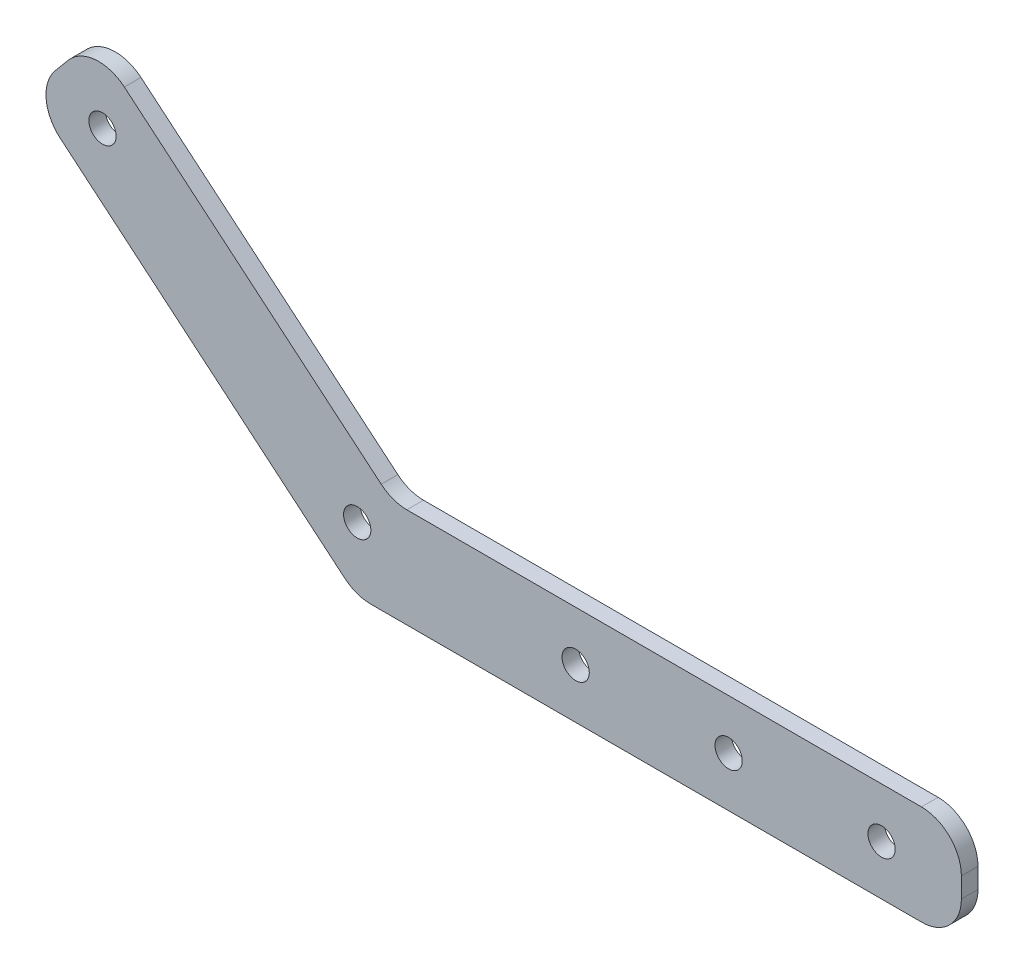
ISO-10303-21;
HEADER;
FILE_DESCRIPTION(('STEP AP214'),'2;1');
FILE_NAME('part.step','',(''),(''),'','','');
FILE_SCHEMA(('AUTOMOTIVE_DESIGN { 1 0 10303 214 1 1 1 1 }'));
ENDSEC;
DATA;
#1=APPLICATION_CONTEXT('core data for automotive mechanical design processes');
#2=APPLICATION_PROTOCOL_DEFINITION('international standard','automotive_design',2000,#1);
#3=PRODUCT_CONTEXT('',#1,'mechanical');
#4=PRODUCT('Part','Part','',(#3));
#5=PRODUCT_RELATED_PRODUCT_CATEGORY('part','',(#4));
#6=PRODUCT_DEFINITION_FORMATION('','',#4);
#7=PRODUCT_DEFINITION_CONTEXT('part definition',#1,'design');
#8=PRODUCT_DEFINITION('design','',#6,#7);
#9=PRODUCT_DEFINITION_SHAPE('','',#8);
#10=(LENGTH_UNIT() NAMED_UNIT(*) SI_UNIT(.MILLI.,.METRE.));
#11=(NAMED_UNIT(*) PLANE_ANGLE_UNIT() SI_UNIT($,.RADIAN.));
#12=(NAMED_UNIT(*) SI_UNIT($,.STERADIAN.) SOLID_ANGLE_UNIT());
#13=UNCERTAINTY_MEASURE_WITH_UNIT(LENGTH_MEASURE(1.E-05),#10,'distance_accuracy_value','');
#14=(GEOMETRIC_REPRESENTATION_CONTEXT(3) GLOBAL_UNCERTAINTY_ASSIGNED_CONTEXT((#13)) GLOBAL_UNIT_ASSIGNED_CONTEXT((#10,
#11,#12)) REPRESENTATION_CONTEXT('',''));
#15=CARTESIAN_POINT('',(0.,0.,0.));
#16=DIRECTION('',(0.,0.,1.));
#17=DIRECTION('',(1.,0.,0.));
#18=AXIS2_PLACEMENT_3D('',#15,#16,#17);
#19=CARTESIAN_POINT('',(0.,0.,3.175));
#20=DIRECTION('',(0.,0.,1.));
#21=DIRECTION('',(1.,0.,0.));
#22=AXIS2_PLACEMENT_3D('',#19,#20,#21);
#23=PLANE('',#22);
#24=CARTESIAN_POINT('',(-164.021911069028,43.5371171796239,3.175));
#25=DIRECTION('',(0.,0.,1.));
#26=DIRECTION('',(1.,0.,0.));
#27=AXIS2_PLACEMENT_3D('',#24,#25,#26);
#28=CIRCLE('',#27,2.60350000000002);
#29=CARTESIAN_POINT('',(-161.418411069028,43.5371171796239,3.175));
#30=VERTEX_POINT('',#29);
#31=EDGE_CURVE('E294',#30,#30,#28,.T.);
#32=ORIENTED_EDGE('',*,*,#31,.F.);
#33=EDGE_LOOP('',(#32));
#34=FACE_BOUND('',#33,.T.);
#35=CARTESIAN_POINT('',(-44.45,0.,3.175));
#36=DIRECTION('',(0.,0.,1.));
#37=DIRECTION('',(1.,0.,0.));
#38=AXIS2_PLACEMENT_3D('',#35,#36,#37);
#39=CIRCLE('',#38,2.6035);
#40=CARTESIAN_POINT('',(-41.8465,0.,3.175));
#41=VERTEX_POINT('',#40);
#42=EDGE_CURVE('E278',#41,#41,#39,.T.);
#43=ORIENTED_EDGE('',*,*,#42,.F.);
#44=EDGE_LOOP('',(#43));
#45=FACE_BOUND('',#44,.T.);
#46=DIRECTION('',(-0.64278760968654,-0.766044443118978,0.));
#47=VECTOR('',#46,1.);
#48=CARTESIAN_POINT('',(-165.682370628852,57.3644126147474,3.175));
#49=LINE('',#48,#47);
#50=CARTESIAN_POINT('',(-170.580412214663,51.5271539581808,3.175));
#51=VERTEX_POINT('',#50);
#52=CARTESIAN_POINT('',(-173.029433007569,48.6085246298974,3.175));
#53=VERTEX_POINT('',#52);
#54=EDGE_CURVE('E251',#51,#53,#49,.T.);
#55=ORIENTED_EDGE('',*,*,#54,.T.);
#56=CARTESIAN_POINT('',(-167.192174351003,43.710483044086,3.175));
#57=DIRECTION('',(0.,0.,1.));
#58=DIRECTION('',(1.,0.,0.));
#59=AXIS2_PLACEMENT_3D('',#56,#57,#58);
#60=CIRCLE('',#59,7.62);
#61=CARTESIAN_POINT('',(-172.090215936814,37.8732243875194,3.175));
#62=VERTEX_POINT('',#61);
#63=EDGE_CURVE('E202',#53,#62,#60,.T.);
#64=ORIENTED_EDGE('',*,*,#63,.T.);
#65=DIRECTION('',(0.766044443118978,-0.64278760968654,0.));
#66=VECTOR('',#65,1.);
#67=CARTESIAN_POINT('',(-177.927474593381,42.7712659733308,3.175));
#68=LINE('',#67,#66);
#69=CARTESIAN_POINT('',(-117.727800141104,-7.74225865656661,3.175));
#70=VERTEX_POINT('',#69);
#71=EDGE_CURVE('E152',#62,#70,#68,.T.);
#72=ORIENTED_EDGE('',*,*,#71,.T.);
#73=CARTESIAN_POINT('',(-112.829758555293,-1.905,3.175));
#74=DIRECTION('',(0.,0.,1.));
#75=DIRECTION('',(1.,0.,0.));
#76=AXIS2_PLACEMENT_3D('',#73,#74,#75);
#77=CIRCLE('',#76,7.62);
#78=CARTESIAN_POINT('',(-112.829758555293,-9.525,3.175));
#79=VERTEX_POINT('',#78);
#80=EDGE_CURVE('E199',#70,#79,#77,.T.);
#81=ORIENTED_EDGE('',*,*,#80,.T.);
#82=DIRECTION('',(1.,0.,0.));
#83=VECTOR('',#82,1.);
#84=CARTESIAN_POINT('',(-115.603211740401,-9.52500000000001,3.175));
#85=LINE('',#84,#83);
#86=CARTESIAN_POINT('',(-7.61999999999999,-9.52499999999994,3.175));
#87=VERTEX_POINT('',#86);
#88=EDGE_CURVE('E161',#79,#87,#85,.T.);
#89=ORIENTED_EDGE('',*,*,#88,.T.);
#90=CARTESIAN_POINT('',(-7.62,-1.90499999999994,3.175));
#91=DIRECTION('',(0.,0.,1.));
#92=DIRECTION('',(1.,0.,0.));
#93=AXIS2_PLACEMENT_3D('',#90,#91,#92);
#94=CIRCLE('',#93,7.62);
#95=CARTESIAN_POINT('',(0.,-1.90499999999994,3.175));
#96=VERTEX_POINT('',#95);
#97=EDGE_CURVE('E196',#87,#96,#94,.T.);
#98=ORIENTED_EDGE('',*,*,#97,.T.);
#99=DIRECTION('',(0.,1.,0.));
#100=VECTOR('',#99,1.);
#101=CARTESIAN_POINT('',(0.,-9.52499999999993,3.175));
#102=LINE('',#101,#100);
#103=CARTESIAN_POINT('',(0.,1.905,3.175));
#104=VERTEX_POINT('',#103);
#105=EDGE_CURVE('E167',#96,#104,#102,.T.);
#106=ORIENTED_EDGE('',*,*,#105,.T.);
#107=CARTESIAN_POINT('',(-7.62,1.90499999999999,3.175));
#108=DIRECTION('',(0.,0.,1.));
#109=DIRECTION('',(1.,0.,0.));
#110=AXIS2_PLACEMENT_3D('',#107,#108,#109);
#111=CIRCLE('',#110,7.62);
#112=CARTESIAN_POINT('',(-7.62,9.52499999999999,3.175));
#113=VERTEX_POINT('',#112);
#114=EDGE_CURVE('E193',#104,#113,#111,.T.);
#115=ORIENTED_EDGE('',*,*,#114,.T.);
#116=DIRECTION('',(-1.,0.,0.));
#117=VECTOR('',#116,1.);
#118=CARTESIAN_POINT('',(0.,9.525,3.175));
#119=LINE('',#118,#117);
#120=CARTESIAN_POINT('',(-105.896125592522,9.52499999999991,3.175));
#121=VERTEX_POINT('',#120);
#122=EDGE_CURVE('E252',#113,#121,#119,.T.);
#123=ORIENTED_EDGE('',*,*,#122,.T.);
#124=CARTESIAN_POINT('',(-105.896125592522,17.1449999999999,3.175));
#125=DIRECTION('',(0.,0.,1.));
#126=DIRECTION('',(1.,0.,0.));
#127=AXIS2_PLACEMENT_3D('',#124,#125,#126);
#128=CIRCLE('',#127,7.62);
#129=CARTESIAN_POINT('',(-110.794167178333,11.3077413434333,3.175));
#130=VERTEX_POINT('',#129);
#131=EDGE_CURVE('E11',#121,#130,#128,.F.);
#132=ORIENTED_EDGE('',*,*,#131,.T.);
#133=DIRECTION('',(-0.766044443118978,0.64278760968654,0.));
#134=VECTOR('',#133,1.);
#135=CARTESIAN_POINT('',(-108.66957877763,9.52499999999991,3.175));
#136=LINE('',#135,#134);
#137=CARTESIAN_POINT('',(-159.845111972285,52.466371028936,3.175));
#138=VERTEX_POINT('',#137);
#139=EDGE_CURVE('E248',#130,#138,#136,.T.);
#140=ORIENTED_EDGE('',*,*,#139,.T.);
#141=CARTESIAN_POINT('',(-164.743153558097,46.6291123723694,3.175));
#142=DIRECTION('',(0.,0.,1.));
#143=DIRECTION('',(1.,0.,0.));
#144=AXIS2_PLACEMENT_3D('',#141,#142,#143);
#145=CIRCLE('',#144,7.62);
#146=EDGE_CURVE('E190',#138,#51,#145,.T.);
#147=ORIENTED_EDGE('',*,*,#146,.T.);
#148=EDGE_LOOP('',(#55,#64,#72,#81,#89,#98,#106,#115,#123,#132,#140,#147));
#149=FACE_BOUND('',#148,.T.);
#150=CARTESIAN_POINT('',(-73.66,0.,3.175));
#151=DIRECTION('',(0.,0.,1.));
#152=DIRECTION('',(1.,0.,0.));
#153=AXIS2_PLACEMENT_3D('',#150,#151,#152);
#154=CIRCLE('',#153,2.60349999999999);
#155=CARTESIAN_POINT('',(-71.0565,0.,3.175));
#156=VERTEX_POINT('',#155);
#157=EDGE_CURVE('E267',#156,#156,#154,.T.);
#158=ORIENTED_EDGE('',*,*,#157,.F.);
#159=EDGE_LOOP('',(#158));
#160=FACE_BOUND('',#159,.T.);
#161=CARTESIAN_POINT('',(-15.24,0.,3.175));
#162=DIRECTION('',(0.,0.,1.));
#163=DIRECTION('',(1.,0.,0.));
#164=AXIS2_PLACEMENT_3D('',#161,#162,#163);
#165=CIRCLE('',#164,2.6035);
#166=CARTESIAN_POINT('',(-12.6365,0.,3.175));
#167=VERTEX_POINT('',#166);
#168=EDGE_CURVE('E286',#167,#167,#165,.T.);
#169=ORIENTED_EDGE('',*,*,#168,.F.);
#170=EDGE_LOOP('',(#169));
#171=FACE_BOUND('',#170,.T.);
#172=CARTESIAN_POINT('',(-115.378088930972,2.72010396452861,3.175));
#173=DIRECTION('',(0.,0.,1.));
#174=DIRECTION('',(1.,0.,0.));
#175=AXIS2_PLACEMENT_3D('',#172,#173,#174);
#176=CIRCLE('',#175,2.60349999999999);
#177=CARTESIAN_POINT('',(-112.774588930972,2.72010396452861,3.175));
#178=VERTEX_POINT('',#177);
#179=EDGE_CURVE('E302',#178,#178,#176,.T.);
#180=ORIENTED_EDGE('',*,*,#179,.F.);
#181=EDGE_LOOP('',(#180));
#182=FACE_BOUND('',#181,.T.);
#183=ADVANCED_FACE('F41',(#34,#45,#149,#160,#171,#182),#23,.T.);
#184=CARTESIAN_POINT('',(0.,0.,0.));
#185=DIRECTION('',(0.,0.,1.));
#186=DIRECTION('',(1.,0.,0.));
#187=AXIS2_PLACEMENT_3D('',#184,#185,#186);
#188=PLANE('',#187);
#189=DIRECTION('',(0.766044443118978,-0.64278760968654,0.));
#190=VECTOR('',#189,1.);
#191=CARTESIAN_POINT('',(-177.927474593381,42.7712659733308,0.));
#192=LINE('',#191,#190);
#193=CARTESIAN_POINT('',(-172.090215936814,37.8732243875194,0.));
#194=VERTEX_POINT('',#193);
#195=CARTESIAN_POINT('',(-117.727800141104,-7.74225865656661,0.));
#196=VERTEX_POINT('',#195);
#197=EDGE_CURVE('E149',#194,#196,#192,.T.);
#198=ORIENTED_EDGE('',*,*,#197,.F.);
#199=CARTESIAN_POINT('',(-167.192174351003,43.710483044086,0.));
#200=DIRECTION('',(0.,0.,1.));
#201=DIRECTION('',(1.,0.,0.));
#202=AXIS2_PLACEMENT_3D('',#199,#200,#201);
#203=CIRCLE('',#202,7.62);
#204=CARTESIAN_POINT('',(-173.029433007569,48.6085246298974,0.));
#205=VERTEX_POINT('',#204);
#206=EDGE_CURVE('E131',#194,#205,#203,.F.);
#207=ORIENTED_EDGE('',*,*,#206,.T.);
#208=DIRECTION('',(-0.64278760968654,-0.766044443118978,0.));
#209=VECTOR('',#208,1.);
#210=CARTESIAN_POINT('',(-165.682370628852,57.3644126147474,0.));
#211=LINE('',#210,#209);
#212=CARTESIAN_POINT('',(-170.580412214663,51.5271539581808,0.));
#213=VERTEX_POINT('',#212);
#214=EDGE_CURVE('E162',#213,#205,#211,.T.);
#215=ORIENTED_EDGE('',*,*,#214,.F.);
#216=CARTESIAN_POINT('',(-164.743153558097,46.6291123723694,0.));
#217=DIRECTION('',(0.,0.,1.));
#218=DIRECTION('',(1.,0.,0.));
#219=AXIS2_PLACEMENT_3D('',#216,#217,#218);
#220=CIRCLE('',#219,7.62);
#221=CARTESIAN_POINT('',(-159.845111972285,52.466371028936,0.));
#222=VERTEX_POINT('',#221);
#223=EDGE_CURVE('E154',#213,#222,#220,.F.);
#224=ORIENTED_EDGE('',*,*,#223,.T.);
#225=DIRECTION('',(-0.766044443118978,0.64278760968654,0.));
#226=VECTOR('',#225,1.);
#227=CARTESIAN_POINT('',(-108.66957877763,9.52499999999991,0.));
#228=LINE('',#227,#226);
#229=CARTESIAN_POINT('',(-110.794167178333,11.3077413434333,0.));
#230=VERTEX_POINT('',#229);
#231=EDGE_CURVE('E169',#230,#222,#228,.T.);
#232=ORIENTED_EDGE('',*,*,#231,.F.);
#233=CARTESIAN_POINT('',(-105.896125592522,17.1449999999999,0.));
#234=DIRECTION('',(0.,0.,1.));
#235=DIRECTION('',(1.,0.,0.));
#236=AXIS2_PLACEMENT_3D('',#233,#234,#235);
#237=CIRCLE('',#236,7.62);
#238=CARTESIAN_POINT('',(-105.896125592522,9.52499999999991,0.));
#239=VERTEX_POINT('',#238);
#240=EDGE_CURVE('E50',#230,#239,#237,.T.);
#241=ORIENTED_EDGE('',*,*,#240,.T.);
#242=DIRECTION('',(-1.,0.,0.));
#243=VECTOR('',#242,1.);
#244=CARTESIAN_POINT('',(0.,9.525,0.));
#245=LINE('',#244,#243);
#246=CARTESIAN_POINT('',(-7.62,9.52499999999999,0.));
#247=VERTEX_POINT('',#246);
#248=EDGE_CURVE('E235',#247,#239,#245,.T.);
#249=ORIENTED_EDGE('',*,*,#248,.F.);
#250=CARTESIAN_POINT('',(-7.62,1.90499999999999,0.));
#251=DIRECTION('',(0.,0.,1.));
#252=DIRECTION('',(1.,0.,0.));
#253=AXIS2_PLACEMENT_3D('',#250,#251,#252);
#254=CIRCLE('',#253,7.62);
#255=CARTESIAN_POINT('',(0.,1.905,0.));
#256=VERTEX_POINT('',#255);
#257=EDGE_CURVE('E177',#247,#256,#254,.F.);
#258=ORIENTED_EDGE('',*,*,#257,.T.);
#259=DIRECTION('',(0.,1.,0.));
#260=VECTOR('',#259,1.);
#261=CARTESIAN_POINT('',(0.,-9.52499999999993,0.));
#262=LINE('',#261,#260);
#263=CARTESIAN_POINT('',(0.,-1.90499999999994,0.));
#264=VERTEX_POINT('',#263);
#265=EDGE_CURVE('E244',#264,#256,#262,.T.);
#266=ORIENTED_EDGE('',*,*,#265,.F.);
#267=CARTESIAN_POINT('',(-7.62,-1.90499999999994,0.));
#268=DIRECTION('',(0.,0.,1.));
#269=DIRECTION('',(1.,0.,0.));
#270=AXIS2_PLACEMENT_3D('',#267,#268,#269);
#271=CIRCLE('',#270,7.62);
#272=CARTESIAN_POINT('',(-7.61999999999999,-9.52499999999994,0.));
#273=VERTEX_POINT('',#272);
#274=EDGE_CURVE('E180',#264,#273,#271,.F.);
#275=ORIENTED_EDGE('',*,*,#274,.T.);
#276=DIRECTION('',(1.,0.,0.));
#277=VECTOR('',#276,1.);
#278=CARTESIAN_POINT('',(-115.603211740401,-9.52500000000001,0.));
#279=LINE('',#278,#277);
#280=CARTESIAN_POINT('',(-112.829758555293,-9.525,0.));
#281=VERTEX_POINT('',#280);
#282=EDGE_CURVE('E263',#281,#273,#279,.T.);
#283=ORIENTED_EDGE('',*,*,#282,.F.);
#284=CARTESIAN_POINT('',(-112.829758555293,-1.905,0.));
#285=DIRECTION('',(0.,0.,1.));
#286=DIRECTION('',(1.,0.,0.));
#287=AXIS2_PLACEMENT_3D('',#284,#285,#286);
#288=CIRCLE('',#287,7.62);
#289=EDGE_CURVE('E143',#281,#196,#288,.F.);
#290=ORIENTED_EDGE('',*,*,#289,.T.);
#291=EDGE_LOOP('',(#198,#207,#215,#224,#232,#241,#249,#258,#266,#275,#283,#290));
#292=FACE_BOUND('',#291,.T.);
#293=CARTESIAN_POINT('',(-73.66,0.,0.));
#294=DIRECTION('',(0.,0.,1.));
#295=DIRECTION('',(1.,0.,0.));
#296=AXIS2_PLACEMENT_3D('',#293,#294,#295);
#297=CIRCLE('',#296,2.60349999999999);
#298=CARTESIAN_POINT('',(-71.0565,0.,0.));
#299=VERTEX_POINT('',#298);
#300=EDGE_CURVE('E274',#299,#299,#297,.T.);
#301=ORIENTED_EDGE('',*,*,#300,.T.);
#302=EDGE_LOOP('',(#301));
#303=FACE_BOUND('',#302,.T.);
#304=CARTESIAN_POINT('',(-44.45,0.,0.));
#305=DIRECTION('',(0.,0.,1.));
#306=DIRECTION('',(1.,0.,0.));
#307=AXIS2_PLACEMENT_3D('',#304,#305,#306);
#308=CIRCLE('',#307,2.6035);
#309=CARTESIAN_POINT('',(-41.8465,0.,0.));
#310=VERTEX_POINT('',#309);
#311=EDGE_CURVE('E282',#310,#310,#308,.T.);
#312=ORIENTED_EDGE('',*,*,#311,.T.);
#313=EDGE_LOOP('',(#312));
#314=FACE_BOUND('',#313,.T.);
#315=CARTESIAN_POINT('',(-15.24,0.,0.));
#316=DIRECTION('',(0.,0.,1.));
#317=DIRECTION('',(1.,0.,0.));
#318=AXIS2_PLACEMENT_3D('',#315,#316,#317);
#319=CIRCLE('',#318,2.6035);
#320=CARTESIAN_POINT('',(-12.6365,0.,0.));
#321=VERTEX_POINT('',#320);
#322=EDGE_CURVE('E290',#321,#321,#319,.T.);
#323=ORIENTED_EDGE('',*,*,#322,.T.);
#324=EDGE_LOOP('',(#323));
#325=FACE_BOUND('',#324,.T.);
#326=CARTESIAN_POINT('',(-164.021911069028,43.5371171796239,0.));
#327=DIRECTION('',(0.,0.,1.));
#328=DIRECTION('',(1.,0.,0.));
#329=AXIS2_PLACEMENT_3D('',#326,#327,#328);
#330=CIRCLE('',#329,2.60350000000002);
#331=CARTESIAN_POINT('',(-161.418411069028,43.5371171796239,0.));
#332=VERTEX_POINT('',#331);
#333=EDGE_CURVE('E298',#332,#332,#330,.T.);
#334=ORIENTED_EDGE('',*,*,#333,.T.);
#335=EDGE_LOOP('',(#334));
#336=FACE_BOUND('',#335,.T.);
#337=CARTESIAN_POINT('',(-115.378088930972,2.72010396452861,0.));
#338=DIRECTION('',(0.,0.,1.));
#339=DIRECTION('',(1.,0.,0.));
#340=AXIS2_PLACEMENT_3D('',#337,#338,#339);
#341=CIRCLE('',#340,2.60349999999999);
#342=CARTESIAN_POINT('',(-112.774588930972,2.72010396452861,0.));
#343=VERTEX_POINT('',#342);
#344=EDGE_CURVE('E306',#343,#343,#341,.T.);
#345=ORIENTED_EDGE('',*,*,#344,.T.);
#346=EDGE_LOOP('',(#345));
#347=FACE_BOUND('',#346,.T.);
#348=ADVANCED_FACE('F157',(#292,#303,#314,#325,#336,#347),#188,.F.);
#349=CARTESIAN_POINT('',(-115.603211740401,-9.52500000000001,3.175));
#350=DIRECTION('',(0.,1.,0.));
#351=DIRECTION('',(-1.,0.,0.));
#352=AXIS2_PLACEMENT_3D('',#349,#350,#351);
#353=PLANE('',#352);
#354=ORIENTED_EDGE('',*,*,#88,.F.);
#355=DIRECTION('',(0.,0.,-1.));
#356=VECTOR('',#355,1.);
#357=CARTESIAN_POINT('',(-112.829758555293,-9.525,3.175));
#358=LINE('',#357,#356);
#359=EDGE_CURVE('E208',#79,#281,#358,.T.);
#360=ORIENTED_EDGE('',*,*,#359,.T.);
#361=ORIENTED_EDGE('',*,*,#282,.T.);
#362=DIRECTION('',(0.,0.,-1.));
#363=VECTOR('',#362,1.);
#364=CARTESIAN_POINT('',(-7.61999999999999,-9.52499999999994,3.175));
#365=LINE('',#364,#363);
#366=EDGE_CURVE('E205',#273,#87,#365,.F.);
#367=ORIENTED_EDGE('',*,*,#366,.T.);
#368=EDGE_LOOP('',(#354,#360,#361,#367));
#369=FACE_BOUND('',#368,.T.);
#370=ADVANCED_FACE('F330',(#369),#353,.F.);
#371=CARTESIAN_POINT('',(0.,-9.52499999999993,3.175));
#372=DIRECTION('',(-1.,0.,0.));
#373=DIRECTION('',(0.,-1.,0.));
#374=AXIS2_PLACEMENT_3D('',#371,#372,#373);
#375=PLANE('',#374);
#376=ORIENTED_EDGE('',*,*,#105,.F.);
#377=DIRECTION('',(0.,0.,-1.));
#378=VECTOR('',#377,1.);
#379=CARTESIAN_POINT('',(0.,-1.90499999999994,3.175));
#380=LINE('',#379,#378);
#381=EDGE_CURVE('E215',#96,#264,#380,.T.);
#382=ORIENTED_EDGE('',*,*,#381,.T.);
#383=ORIENTED_EDGE('',*,*,#265,.T.);
#384=DIRECTION('',(0.,0.,-1.));
#385=VECTOR('',#384,1.);
#386=CARTESIAN_POINT('',(0.,1.905,3.175));
#387=LINE('',#386,#385);
#388=EDGE_CURVE('E212',#256,#104,#387,.F.);
#389=ORIENTED_EDGE('',*,*,#388,.T.);
#390=EDGE_LOOP('',(#376,#382,#383,#389));
#391=FACE_BOUND('',#390,.T.);
#392=ADVANCED_FACE('F324',(#391),#375,.F.);
#393=CARTESIAN_POINT('',(0.,9.525,3.175));
#394=DIRECTION('',(0.,-1.,0.));
#395=DIRECTION('',(1.,0.,0.));
#396=AXIS2_PLACEMENT_3D('',#393,#394,#395);
#397=PLANE('',#396);
#398=ORIENTED_EDGE('',*,*,#122,.F.);
#399=DIRECTION('',(0.,0.,-1.));
#400=VECTOR('',#399,1.);
#401=CARTESIAN_POINT('',(-7.62,9.52499999999999,3.175));
#402=LINE('',#401,#400);
#403=EDGE_CURVE('E222',#113,#247,#402,.T.);
#404=ORIENTED_EDGE('',*,*,#403,.T.);
#405=ORIENTED_EDGE('',*,*,#248,.T.);
#406=DIRECTION('',(0.,0.,-1.));
#407=VECTOR('',#406,1.);
#408=CARTESIAN_POINT('',(-105.896125592522,9.52499999999992,3.175));
#409=LINE('',#408,#407);
#410=EDGE_CURVE('E219',#239,#121,#409,.F.);
#411=ORIENTED_EDGE('',*,*,#410,.T.);
#412=EDGE_LOOP('',(#398,#404,#405,#411));
#413=FACE_BOUND('',#412,.T.);
#414=ADVANCED_FACE('F241',(#413),#397,.F.);
#415=CARTESIAN_POINT('',(-108.66957877763,9.52499999999991,3.175));
#416=DIRECTION('',(-0.64278760968654,-0.766044443118978,0.));
#417=DIRECTION('',(0.766044443118978,-0.64278760968654,0.));
#418=AXIS2_PLACEMENT_3D('',#415,#416,#417);
#419=PLANE('',#418);
#420=ORIENTED_EDGE('',*,*,#139,.F.);
#421=DIRECTION('',(0.,0.,-1.));
#422=VECTOR('',#421,1.);
#423=CARTESIAN_POINT('',(-110.794167178333,11.3077413434333,0.));
#424=LINE('',#423,#422);
#425=EDGE_CURVE('E228',#130,#230,#424,.T.);
#426=ORIENTED_EDGE('',*,*,#425,.T.);
#427=ORIENTED_EDGE('',*,*,#231,.T.);
#428=DIRECTION('',(0.,0.,-1.));
#429=VECTOR('',#428,1.);
#430=CARTESIAN_POINT('',(-159.845111972285,52.466371028936,3.175));
#431=LINE('',#430,#429);
#432=EDGE_CURVE('E57',#222,#138,#431,.F.);
#433=ORIENTED_EDGE('',*,*,#432,.T.);
#434=EDGE_LOOP('',(#420,#426,#427,#433));
#435=FACE_BOUND('',#434,.T.);
#436=ADVANCED_FACE('F247',(#435),#419,.F.);
#437=CARTESIAN_POINT('',(-165.682370628852,57.3644126147474,3.175));
#438=DIRECTION('',(0.766044443118978,-0.64278760968654,0.));
#439=DIRECTION('',(0.64278760968654,0.766044443118978,0.));
#440=AXIS2_PLACEMENT_3D('',#437,#438,#439);
#441=PLANE('',#440);
#442=ORIENTED_EDGE('',*,*,#214,.T.);
#443=DIRECTION('',(0.,0.,-1.));
#444=VECTOR('',#443,1.);
#445=CARTESIAN_POINT('',(-173.029433007569,48.6085246298974,3.175));
#446=LINE('',#445,#444);
#447=EDGE_CURVE('E136',#205,#53,#446,.F.);
#448=ORIENTED_EDGE('',*,*,#447,.T.);
#449=ORIENTED_EDGE('',*,*,#54,.F.);
#450=DIRECTION('',(0.,0.,-1.));
#451=VECTOR('',#450,1.);
#452=CARTESIAN_POINT('',(-170.580412214663,51.5271539581808,3.175));
#453=LINE('',#452,#451);
#454=EDGE_CURVE('E142',#51,#213,#453,.T.);
#455=ORIENTED_EDGE('',*,*,#454,.T.);
#456=EDGE_LOOP('',(#442,#448,#449,#455));
#457=FACE_BOUND('',#456,.T.);
#458=ADVANCED_FACE('F338',(#457),#441,.F.);
#459=CARTESIAN_POINT('',(-177.927474593381,42.7712659733308,3.175));
#460=DIRECTION('',(0.64278760968654,0.766044443118978,0.));
#461=DIRECTION('',(-0.766044443118978,0.64278760968654,0.));
#462=AXIS2_PLACEMENT_3D('',#459,#460,#461);
#463=PLANE('',#462);
#464=ORIENTED_EDGE('',*,*,#71,.F.);
#465=DIRECTION('',(0.,0.,-1.));
#466=VECTOR('',#465,1.);
#467=CARTESIAN_POINT('',(-172.090215936814,37.8732243875194,3.175));
#468=LINE('',#467,#466);
#469=EDGE_CURVE('E135',#62,#194,#468,.T.);
#470=ORIENTED_EDGE('',*,*,#469,.T.);
#471=ORIENTED_EDGE('',*,*,#197,.T.);
#472=DIRECTION('',(0.,0.,-1.));
#473=VECTOR('',#472,1.);
#474=CARTESIAN_POINT('',(-117.727800141104,-7.74225865656661,3.175));
#475=LINE('',#474,#473);
#476=EDGE_CURVE('E155',#196,#70,#475,.F.);
#477=ORIENTED_EDGE('',*,*,#476,.T.);
#478=EDGE_LOOP('',(#464,#470,#471,#477));
#479=FACE_BOUND('',#478,.T.);
#480=ADVANCED_FACE('F148',(#479),#463,.F.);
#481=CARTESIAN_POINT('',(-73.66,0.,3.175));
#482=DIRECTION('',(0.,0.,-1.));
#483=DIRECTION('',(-1.,0.,0.));
#484=AXIS2_PLACEMENT_3D('',#481,#482,#483);
#485=CYLINDRICAL_SURFACE('',#484,2.60349999999999);
#486=ORIENTED_EDGE('',*,*,#157,.T.);
#487=EDGE_LOOP('',(#486));
#488=FACE_BOUND('',#487,.T.);
#489=ORIENTED_EDGE('',*,*,#300,.F.);
#490=EDGE_LOOP('',(#489));
#491=FACE_BOUND('',#490,.T.);
#492=ADVANCED_FACE('F354',(#488,#491),#485,.F.);
#493=CARTESIAN_POINT('',(-44.45,0.,3.175));
#494=DIRECTION('',(0.,0.,-1.));
#495=DIRECTION('',(-1.,0.,0.));
#496=AXIS2_PLACEMENT_3D('',#493,#494,#495);
#497=CYLINDRICAL_SURFACE('',#496,2.6035);
#498=ORIENTED_EDGE('',*,*,#42,.T.);
#499=EDGE_LOOP('',(#498));
#500=FACE_BOUND('',#499,.T.);
#501=ORIENTED_EDGE('',*,*,#311,.F.);
#502=EDGE_LOOP('',(#501));
#503=FACE_BOUND('',#502,.T.);
#504=ADVANCED_FACE('F434',(#500,#503),#497,.F.);
#505=CARTESIAN_POINT('',(-15.24,0.,3.175));
#506=DIRECTION('',(0.,0.,-1.));
#507=DIRECTION('',(-1.,0.,0.));
#508=AXIS2_PLACEMENT_3D('',#505,#506,#507);
#509=CYLINDRICAL_SURFACE('',#508,2.6035);
#510=ORIENTED_EDGE('',*,*,#168,.T.);
#511=EDGE_LOOP('',(#510));
#512=FACE_BOUND('',#511,.T.);
#513=ORIENTED_EDGE('',*,*,#322,.F.);
#514=EDGE_LOOP('',(#513));
#515=FACE_BOUND('',#514,.T.);
#516=ADVANCED_FACE('F425',(#512,#515),#509,.F.);
#517=CARTESIAN_POINT('',(-164.021911069028,43.5371171796239,3.175));
#518=DIRECTION('',(0.,0.,-1.));
#519=DIRECTION('',(-1.,0.,0.));
#520=AXIS2_PLACEMENT_3D('',#517,#518,#519);
#521=CYLINDRICAL_SURFACE('',#520,2.60350000000002);
#522=ORIENTED_EDGE('',*,*,#31,.T.);
#523=EDGE_LOOP('',(#522));
#524=FACE_BOUND('',#523,.T.);
#525=ORIENTED_EDGE('',*,*,#333,.F.);
#526=EDGE_LOOP('',(#525));
#527=FACE_BOUND('',#526,.T.);
#528=ADVANCED_FACE('F416',(#524,#527),#521,.F.);
#529=CARTESIAN_POINT('',(-115.378088930972,2.72010396452861,3.175));
#530=DIRECTION('',(0.,0.,-1.));
#531=DIRECTION('',(-1.,0.,0.));
#532=AXIS2_PLACEMENT_3D('',#529,#530,#531);
#533=CYLINDRICAL_SURFACE('',#532,2.60349999999999);
#534=ORIENTED_EDGE('',*,*,#179,.T.);
#535=EDGE_LOOP('',(#534));
#536=FACE_BOUND('',#535,.T.);
#537=ORIENTED_EDGE('',*,*,#344,.F.);
#538=EDGE_LOOP('',(#537));
#539=FACE_BOUND('',#538,.T.);
#540=ADVANCED_FACE('F371',(#536,#539),#533,.F.);
#541=CARTESIAN_POINT('',(-167.192174351003,43.710483044086,3.175));
#542=DIRECTION('',(0.,0.,-1.));
#543=DIRECTION('',(-1.,0.,0.));
#544=AXIS2_PLACEMENT_3D('',#541,#542,#543);
#545=CYLINDRICAL_SURFACE('',#544,7.62);
#546=ORIENTED_EDGE('',*,*,#63,.F.);
#547=ORIENTED_EDGE('',*,*,#447,.F.);
#548=ORIENTED_EDGE('',*,*,#206,.F.);
#549=ORIENTED_EDGE('',*,*,#469,.F.);
#550=EDGE_LOOP('',(#546,#547,#548,#549));
#551=FACE_BOUND('',#550,.T.);
#552=ADVANCED_FACE('F134',(#551),#545,.T.);
#553=CARTESIAN_POINT('',(-112.829758555293,-1.905,3.175));
#554=DIRECTION('',(0.,0.,-1.));
#555=DIRECTION('',(-1.,0.,0.));
#556=AXIS2_PLACEMENT_3D('',#553,#554,#555);
#557=CYLINDRICAL_SURFACE('',#556,7.62);
#558=ORIENTED_EDGE('',*,*,#80,.F.);
#559=ORIENTED_EDGE('',*,*,#476,.F.);
#560=ORIENTED_EDGE('',*,*,#289,.F.);
#561=ORIENTED_EDGE('',*,*,#359,.F.);
#562=EDGE_LOOP('',(#558,#559,#560,#561));
#563=FACE_BOUND('',#562,.T.);
#564=ADVANCED_FACE('F334',(#563),#557,.T.);
#565=CARTESIAN_POINT('',(-7.62,-1.90499999999994,3.175));
#566=DIRECTION('',(0.,0.,-1.));
#567=DIRECTION('',(-1.,0.,0.));
#568=AXIS2_PLACEMENT_3D('',#565,#566,#567);
#569=CYLINDRICAL_SURFACE('',#568,7.62);
#570=ORIENTED_EDGE('',*,*,#97,.F.);
#571=ORIENTED_EDGE('',*,*,#366,.F.);
#572=ORIENTED_EDGE('',*,*,#274,.F.);
#573=ORIENTED_EDGE('',*,*,#381,.F.);
#574=EDGE_LOOP('',(#570,#571,#572,#573));
#575=FACE_BOUND('',#574,.T.);
#576=ADVANCED_FACE('F326',(#575),#569,.T.);
#577=CARTESIAN_POINT('',(-7.62,1.90499999999999,3.175));
#578=DIRECTION('',(0.,0.,-1.));
#579=DIRECTION('',(-1.,0.,0.));
#580=AXIS2_PLACEMENT_3D('',#577,#578,#579);
#581=CYLINDRICAL_SURFACE('',#580,7.62);
#582=ORIENTED_EDGE('',*,*,#114,.F.);
#583=ORIENTED_EDGE('',*,*,#388,.F.);
#584=ORIENTED_EDGE('',*,*,#257,.F.);
#585=ORIENTED_EDGE('',*,*,#403,.F.);
#586=EDGE_LOOP('',(#582,#583,#584,#585));
#587=FACE_BOUND('',#586,.T.);
#588=ADVANCED_FACE('F322',(#587),#581,.T.);
#589=CARTESIAN_POINT('',(-105.896125592522,17.1449999999999,3.175));
#590=DIRECTION('',(0.,0.,1.));
#591=DIRECTION('',(1.,0.,0.));
#592=AXIS2_PLACEMENT_3D('',#589,#590,#591);
#593=CYLINDRICAL_SURFACE('',#592,7.62);
#594=ORIENTED_EDGE('',*,*,#131,.F.);
#595=ORIENTED_EDGE('',*,*,#410,.F.);
#596=ORIENTED_EDGE('',*,*,#240,.F.);
#597=ORIENTED_EDGE('',*,*,#425,.F.);
#598=EDGE_LOOP('',(#594,#595,#596,#597));
#599=FACE_BOUND('',#598,.T.);
#600=ADVANCED_FACE('F246',(#599),#593,.F.);
#601=CARTESIAN_POINT('',(-164.743153558097,46.6291123723694,3.175));
#602=DIRECTION('',(0.,0.,-1.));
#603=DIRECTION('',(-1.,0.,0.));
#604=AXIS2_PLACEMENT_3D('',#601,#602,#603);
#605=CYLINDRICAL_SURFACE('',#604,7.62);
#606=ORIENTED_EDGE('',*,*,#146,.F.);
#607=ORIENTED_EDGE('',*,*,#432,.F.);
#608=ORIENTED_EDGE('',*,*,#223,.F.);
#609=ORIENTED_EDGE('',*,*,#454,.F.);
#610=EDGE_LOOP('',(#606,#607,#608,#609));
#611=FACE_BOUND('',#610,.T.);
#612=ADVANCED_FACE('F43',(#611),#605,.T.);
#613=CLOSED_SHELL('',(#183,#348,#370,#392,#414,#436,#458,#480,#492,#504,#516,#528,#540,#552,
#564,#576,#588,#600,#612));
#614=MANIFOLD_SOLID_BREP('B2',#613);
#615=ADVANCED_BREP_SHAPE_REPRESENTATION('',(#18,#614),#14);
#616=SHAPE_DEFINITION_REPRESENTATION(#9,#615);
ENDSEC;
END-ISO-10303-21;
